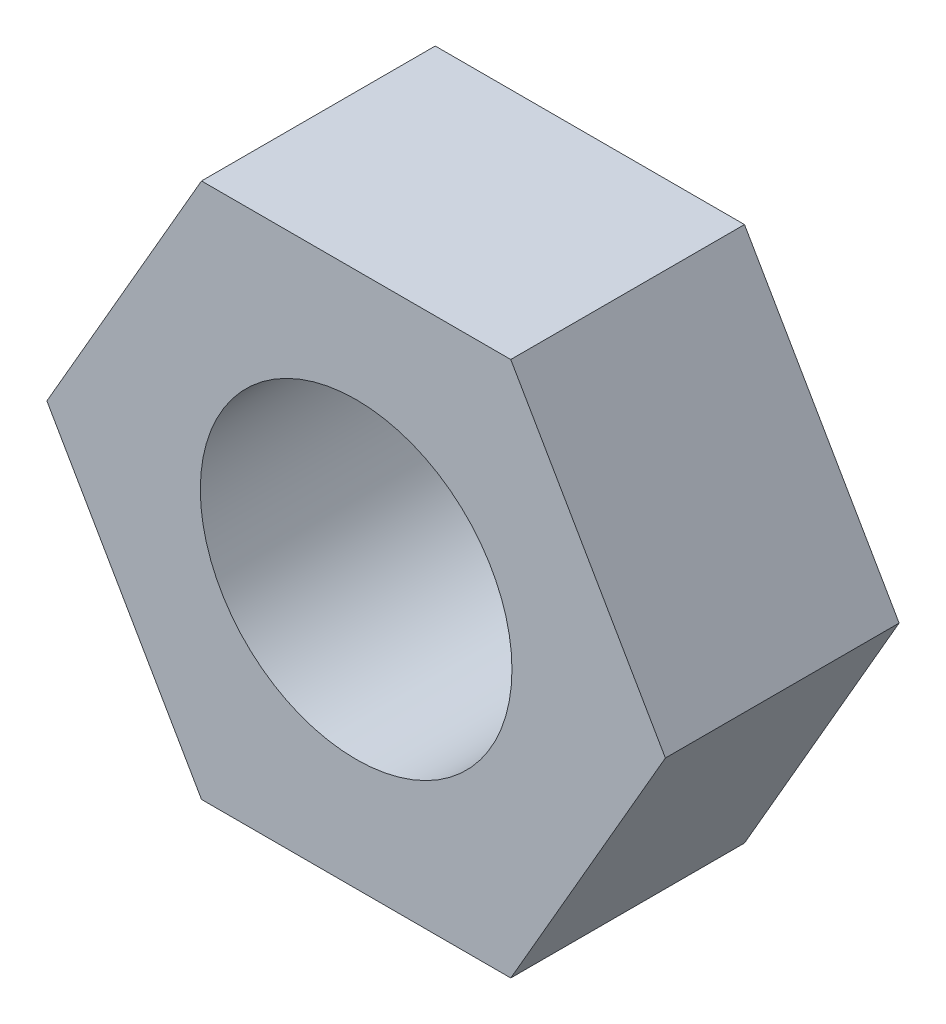
ISO-10303-21;
HEADER;
FILE_DESCRIPTION(('STEP AP214'),'2;1');
FILE_NAME('part.step','',(''),(''),'','','');
FILE_SCHEMA(('AUTOMOTIVE_DESIGN { 1 0 10303 214 1 1 1 1 }'));
ENDSEC;
DATA;
#1=APPLICATION_CONTEXT('core data for automotive mechanical design processes');
#2=APPLICATION_PROTOCOL_DEFINITION('international standard','automotive_design',2000,#1);
#3=PRODUCT_CONTEXT('',#1,'mechanical');
#4=PRODUCT('Part','Part','',(#3));
#5=PRODUCT_RELATED_PRODUCT_CATEGORY('part','',(#4));
#6=PRODUCT_DEFINITION_FORMATION('','',#4);
#7=PRODUCT_DEFINITION_CONTEXT('part definition',#1,'design');
#8=PRODUCT_DEFINITION('design','',#6,#7);
#9=PRODUCT_DEFINITION_SHAPE('','',#8);
#10=(LENGTH_UNIT() NAMED_UNIT(*) SI_UNIT(.MILLI.,.METRE.));
#11=(NAMED_UNIT(*) PLANE_ANGLE_UNIT() SI_UNIT($,.RADIAN.));
#12=(NAMED_UNIT(*) SI_UNIT($,.STERADIAN.) SOLID_ANGLE_UNIT());
#13=UNCERTAINTY_MEASURE_WITH_UNIT(LENGTH_MEASURE(1.E-05),#10,'distance_accuracy_value','');
#14=(GEOMETRIC_REPRESENTATION_CONTEXT(3) GLOBAL_UNCERTAINTY_ASSIGNED_CONTEXT((#13)) GLOBAL_UNIT_ASSIGNED_CONTEXT((#10,
#11,#12)) REPRESENTATION_CONTEXT('',''));
#15=CARTESIAN_POINT('',(0.,0.,0.));
#16=DIRECTION('',(0.,0.,1.));
#17=DIRECTION('',(1.,0.,0.));
#18=AXIS2_PLACEMENT_3D('',#15,#16,#17);
#19=CARTESIAN_POINT('',(0.,0.,2.4));
#20=DIRECTION('',(0.,0.,1.));
#21=DIRECTION('',(1.,0.,0.));
#22=AXIS2_PLACEMENT_3D('',#19,#20,#21);
#23=PLANE('',#22);
#24=DIRECTION('',(0.5,0.866025403784439,0.));
#25=VECTOR('',#24,1.);
#26=CARTESIAN_POINT('',(1.58771324027147,-2.75,2.4));
#27=LINE('',#26,#25);
#28=CARTESIAN_POINT('',(1.58771324027147,-2.75,2.4));
#29=VERTEX_POINT('',#28);
#30=CARTESIAN_POINT('',(3.17542648054294,0.,2.4));
#31=VERTEX_POINT('',#30);
#32=EDGE_CURVE('E135',#29,#31,#27,.T.);
#33=ORIENTED_EDGE('',*,*,#32,.T.);
#34=DIRECTION('',(-0.5,0.866025403784439,0.));
#35=VECTOR('',#34,1.);
#36=CARTESIAN_POINT('',(3.17542648054294,0.,2.4));
#37=LINE('',#36,#35);
#38=CARTESIAN_POINT('',(1.58771324027147,2.75,2.4));
#39=VERTEX_POINT('',#38);
#40=EDGE_CURVE('E93',#31,#39,#37,.T.);
#41=ORIENTED_EDGE('',*,*,#40,.T.);
#42=DIRECTION('',(-1.,0.,0.));
#43=VECTOR('',#42,1.);
#44=CARTESIAN_POINT('',(1.58771324027147,2.75,2.4));
#45=LINE('',#44,#43);
#46=CARTESIAN_POINT('',(-1.58771324027147,2.75,2.4));
#47=VERTEX_POINT('',#46);
#48=EDGE_CURVE('E106',#39,#47,#45,.T.);
#49=ORIENTED_EDGE('',*,*,#48,.T.);
#50=DIRECTION('',(-0.5,-0.866025403784438,0.));
#51=VECTOR('',#50,1.);
#52=CARTESIAN_POINT('',(-1.58771324027147,2.75,2.4));
#53=LINE('',#52,#51);
#54=CARTESIAN_POINT('',(-3.17542648054294,0.,2.4));
#55=VERTEX_POINT('',#54);
#56=EDGE_CURVE('E100',#47,#55,#53,.T.);
#57=ORIENTED_EDGE('',*,*,#56,.T.);
#58=DIRECTION('',(0.5,-0.866025403784439,0.));
#59=VECTOR('',#58,1.);
#60=CARTESIAN_POINT('',(-3.17542648054294,0.,2.4));
#61=LINE('',#60,#59);
#62=CARTESIAN_POINT('',(-1.58771324027147,-2.75,2.4));
#63=VERTEX_POINT('',#62);
#64=EDGE_CURVE('E104',#55,#63,#61,.T.);
#65=ORIENTED_EDGE('',*,*,#64,.T.);
#66=DIRECTION('',(1.,0.,0.));
#67=VECTOR('',#66,1.);
#68=CARTESIAN_POINT('',(-1.58771324027147,-2.75,2.4));
#69=LINE('',#68,#67);
#70=EDGE_CURVE('E56',#63,#29,#69,.T.);
#71=ORIENTED_EDGE('',*,*,#70,.T.);
#72=EDGE_LOOP('',(#33,#41,#49,#57,#65,#71));
#73=FACE_BOUND('',#72,.T.);
#74=CARTESIAN_POINT('',(0.,0.,2.4));
#75=DIRECTION('',(0.,0.,1.));
#76=DIRECTION('',(1.,0.,0.));
#77=AXIS2_PLACEMENT_3D('',#74,#75,#76);
#78=CIRCLE('',#77,1.6);
#79=CARTESIAN_POINT('',(1.6,0.,2.4));
#80=VERTEX_POINT('',#79);
#81=EDGE_CURVE('E128',#80,#80,#78,.T.);
#82=ORIENTED_EDGE('',*,*,#81,.F.);
#83=EDGE_LOOP('',(#82));
#84=FACE_BOUND('',#83,.T.);
#85=ADVANCED_FACE('F39',(#73,#84),#23,.T.);
#86=CARTESIAN_POINT('',(0.,0.,0.));
#87=DIRECTION('',(0.,0.,1.));
#88=DIRECTION('',(1.,0.,0.));
#89=AXIS2_PLACEMENT_3D('',#86,#87,#88);
#90=PLANE('',#89);
#91=DIRECTION('',(0.5,0.866025403784439,0.));
#92=VECTOR('',#91,1.);
#93=CARTESIAN_POINT('',(1.58771324027147,-2.75,0.));
#94=LINE('',#93,#92);
#95=CARTESIAN_POINT('',(1.58771324027147,-2.75,0.));
#96=VERTEX_POINT('',#95);
#97=CARTESIAN_POINT('',(3.17542648054294,0.,0.));
#98=VERTEX_POINT('',#97);
#99=EDGE_CURVE('E124',#96,#98,#94,.T.);
#100=ORIENTED_EDGE('',*,*,#99,.F.);
#101=DIRECTION('',(1.,0.,0.));
#102=VECTOR('',#101,1.);
#103=CARTESIAN_POINT('',(-1.58771324027147,-2.75,0.));
#104=LINE('',#103,#102);
#105=CARTESIAN_POINT('',(-1.58771324027147,-2.75,0.));
#106=VERTEX_POINT('',#105);
#107=EDGE_CURVE('E85',#106,#96,#104,.T.);
#108=ORIENTED_EDGE('',*,*,#107,.F.);
#109=DIRECTION('',(0.5,-0.866025403784439,0.));
#110=VECTOR('',#109,1.);
#111=CARTESIAN_POINT('',(-3.17542648054294,0.,0.));
#112=LINE('',#111,#110);
#113=CARTESIAN_POINT('',(-3.17542648054294,0.,0.));
#114=VERTEX_POINT('',#113);
#115=EDGE_CURVE('E79',#114,#106,#112,.T.);
#116=ORIENTED_EDGE('',*,*,#115,.F.);
#117=DIRECTION('',(-0.5,-0.866025403784438,0.));
#118=VECTOR('',#117,1.);
#119=CARTESIAN_POINT('',(-1.58771324027147,2.75,0.));
#120=LINE('',#119,#118);
#121=CARTESIAN_POINT('',(-1.58771324027147,2.75,0.));
#122=VERTEX_POINT('',#121);
#123=EDGE_CURVE('E114',#122,#114,#120,.T.);
#124=ORIENTED_EDGE('',*,*,#123,.F.);
#125=DIRECTION('',(-1.,0.,0.));
#126=VECTOR('',#125,1.);
#127=CARTESIAN_POINT('',(1.58771324027147,2.75,0.));
#128=LINE('',#127,#126);
#129=CARTESIAN_POINT('',(1.58771324027147,2.75,0.));
#130=VERTEX_POINT('',#129);
#131=EDGE_CURVE('E130',#130,#122,#128,.T.);
#132=ORIENTED_EDGE('',*,*,#131,.F.);
#133=DIRECTION('',(-0.5,0.866025403784439,0.));
#134=VECTOR('',#133,1.);
#135=CARTESIAN_POINT('',(3.17542648054294,0.,0.));
#136=LINE('',#135,#134);
#137=EDGE_CURVE('E127',#98,#130,#136,.T.);
#138=ORIENTED_EDGE('',*,*,#137,.F.);
#139=EDGE_LOOP('',(#100,#108,#116,#124,#132,#138));
#140=FACE_BOUND('',#139,.T.);
#141=CARTESIAN_POINT('',(0.,0.,0.));
#142=DIRECTION('',(0.,0.,1.));
#143=DIRECTION('',(1.,0.,0.));
#144=AXIS2_PLACEMENT_3D('',#141,#142,#143);
#145=CIRCLE('',#144,1.6);
#146=CARTESIAN_POINT('',(1.6,0.,0.));
#147=VERTEX_POINT('',#146);
#148=EDGE_CURVE('E246',#147,#147,#145,.T.);
#149=ORIENTED_EDGE('',*,*,#148,.T.);
#150=EDGE_LOOP('',(#149));
#151=FACE_BOUND('',#150,.T.);
#152=ADVANCED_FACE('F144',(#140,#151),#90,.F.);
#153=CARTESIAN_POINT('',(1.58771324027147,-2.75,2.4));
#154=DIRECTION('',(-0.866025403784439,0.5,0.));
#155=DIRECTION('',(-0.5,-0.866025403784439,0.));
#156=AXIS2_PLACEMENT_3D('',#153,#154,#155);
#157=PLANE('',#156);
#158=ORIENTED_EDGE('',*,*,#99,.T.);
#159=DIRECTION('',(0.,0.,-1.));
#160=VECTOR('',#159,1.);
#161=CARTESIAN_POINT('',(3.17542648054294,0.,2.4));
#162=LINE('',#161,#160);
#163=EDGE_CURVE('E11',#31,#98,#162,.T.);
#164=ORIENTED_EDGE('',*,*,#163,.F.);
#165=ORIENTED_EDGE('',*,*,#32,.F.);
#166=DIRECTION('',(0.,0.,-1.));
#167=VECTOR('',#166,1.);
#168=CARTESIAN_POINT('',(1.58771324027147,-2.75,2.4));
#169=LINE('',#168,#167);
#170=EDGE_CURVE('E120',#29,#96,#169,.T.);
#171=ORIENTED_EDGE('',*,*,#170,.T.);
#172=EDGE_LOOP('',(#158,#164,#165,#171));
#173=FACE_BOUND('',#172,.T.);
#174=ADVANCED_FACE('F41',(#173),#157,.F.);
#175=CARTESIAN_POINT('',(3.17542648054294,0.,2.4));
#176=DIRECTION('',(-0.866025403784439,-0.5,0.));
#177=DIRECTION('',(0.5,-0.866025403784439,0.));
#178=AXIS2_PLACEMENT_3D('',#175,#176,#177);
#179=PLANE('',#178);
#180=ORIENTED_EDGE('',*,*,#137,.T.);
#181=DIRECTION('',(0.,0.,-1.));
#182=VECTOR('',#181,1.);
#183=CARTESIAN_POINT('',(1.58771324027147,2.75,2.4));
#184=LINE('',#183,#182);
#185=EDGE_CURVE('E48',#39,#130,#184,.T.);
#186=ORIENTED_EDGE('',*,*,#185,.F.);
#187=ORIENTED_EDGE('',*,*,#40,.F.);
#188=ORIENTED_EDGE('',*,*,#163,.T.);
#189=EDGE_LOOP('',(#180,#186,#187,#188));
#190=FACE_BOUND('',#189,.T.);
#191=ADVANCED_FACE('F169',(#190),#179,.F.);
#192=CARTESIAN_POINT('',(1.58771324027147,2.75,2.4));
#193=DIRECTION('',(0.,-1.,0.));
#194=DIRECTION('',(1.,0.,0.));
#195=AXIS2_PLACEMENT_3D('',#192,#193,#194);
#196=PLANE('',#195);
#197=ORIENTED_EDGE('',*,*,#131,.T.);
#198=DIRECTION('',(0.,0.,-1.));
#199=VECTOR('',#198,1.);
#200=CARTESIAN_POINT('',(-1.58771324027147,2.75,2.4));
#201=LINE('',#200,#199);
#202=EDGE_CURVE('E115',#47,#122,#201,.T.);
#203=ORIENTED_EDGE('',*,*,#202,.F.);
#204=ORIENTED_EDGE('',*,*,#48,.F.);
#205=ORIENTED_EDGE('',*,*,#185,.T.);
#206=EDGE_LOOP('',(#197,#203,#204,#205));
#207=FACE_BOUND('',#206,.T.);
#208=ADVANCED_FACE('F141',(#207),#196,.F.);
#209=CARTESIAN_POINT('',(-1.58771324027147,2.75,2.4));
#210=DIRECTION('',(0.866025403784439,-0.5,0.));
#211=DIRECTION('',(0.5,0.866025403784439,0.));
#212=AXIS2_PLACEMENT_3D('',#209,#210,#211);
#213=PLANE('',#212);
#214=ORIENTED_EDGE('',*,*,#123,.T.);
#215=DIRECTION('',(0.,0.,-1.));
#216=VECTOR('',#215,1.);
#217=CARTESIAN_POINT('',(-3.17542648054294,0.,2.4));
#218=LINE('',#217,#216);
#219=EDGE_CURVE('E111',#55,#114,#218,.T.);
#220=ORIENTED_EDGE('',*,*,#219,.F.);
#221=ORIENTED_EDGE('',*,*,#56,.F.);
#222=ORIENTED_EDGE('',*,*,#202,.T.);
#223=EDGE_LOOP('',(#214,#220,#221,#222));
#224=FACE_BOUND('',#223,.T.);
#225=ADVANCED_FACE('F112',(#224),#213,.F.);
#226=CARTESIAN_POINT('',(-3.17542648054294,0.,2.4));
#227=DIRECTION('',(0.866025403784439,0.5,0.));
#228=DIRECTION('',(-0.5,0.866025403784439,0.));
#229=AXIS2_PLACEMENT_3D('',#226,#227,#228);
#230=PLANE('',#229);
#231=ORIENTED_EDGE('',*,*,#115,.T.);
#232=DIRECTION('',(0.,0.,-1.));
#233=VECTOR('',#232,1.);
#234=CARTESIAN_POINT('',(-1.58771324027147,-2.75,2.4));
#235=LINE('',#234,#233);
#236=EDGE_CURVE('E116',#63,#106,#235,.T.);
#237=ORIENTED_EDGE('',*,*,#236,.F.);
#238=ORIENTED_EDGE('',*,*,#64,.F.);
#239=ORIENTED_EDGE('',*,*,#219,.T.);
#240=EDGE_LOOP('',(#231,#237,#238,#239));
#241=FACE_BOUND('',#240,.T.);
#242=ADVANCED_FACE('F118',(#241),#230,.F.);
#243=CARTESIAN_POINT('',(-1.58771324027147,-2.75,2.4));
#244=DIRECTION('',(0.,1.,0.));
#245=DIRECTION('',(-1.,0.,0.));
#246=AXIS2_PLACEMENT_3D('',#243,#244,#245);
#247=PLANE('',#246);
#248=ORIENTED_EDGE('',*,*,#107,.T.);
#249=ORIENTED_EDGE('',*,*,#170,.F.);
#250=ORIENTED_EDGE('',*,*,#70,.F.);
#251=ORIENTED_EDGE('',*,*,#236,.T.);
#252=EDGE_LOOP('',(#248,#249,#250,#251));
#253=FACE_BOUND('',#252,.T.);
#254=ADVANCED_FACE('F149',(#253),#247,.F.);
#255=CARTESIAN_POINT('',(0.,0.,2.4));
#256=DIRECTION('',(0.,0.,-1.));
#257=DIRECTION('',(-1.,0.,0.));
#258=AXIS2_PLACEMENT_3D('',#255,#256,#257);
#259=CYLINDRICAL_SURFACE('',#258,1.6);
#260=ORIENTED_EDGE('',*,*,#81,.T.);
#261=EDGE_LOOP('',(#260));
#262=FACE_BOUND('',#261,.T.);
#263=ORIENTED_EDGE('',*,*,#148,.F.);
#264=EDGE_LOOP('',(#263));
#265=FACE_BOUND('',#264,.T.);
#266=ADVANCED_FACE('F151',(#262,#265),#259,.F.);
#267=CLOSED_SHELL('',(#85,#152,#174,#191,#208,#225,#242,#254,#266));
#268=MANIFOLD_SOLID_BREP('B2',#267);
#269=ADVANCED_BREP_SHAPE_REPRESENTATION('',(#18,#268),#14);
#270=SHAPE_DEFINITION_REPRESENTATION(#9,#269);
ENDSEC;
END-ISO-10303-21;
